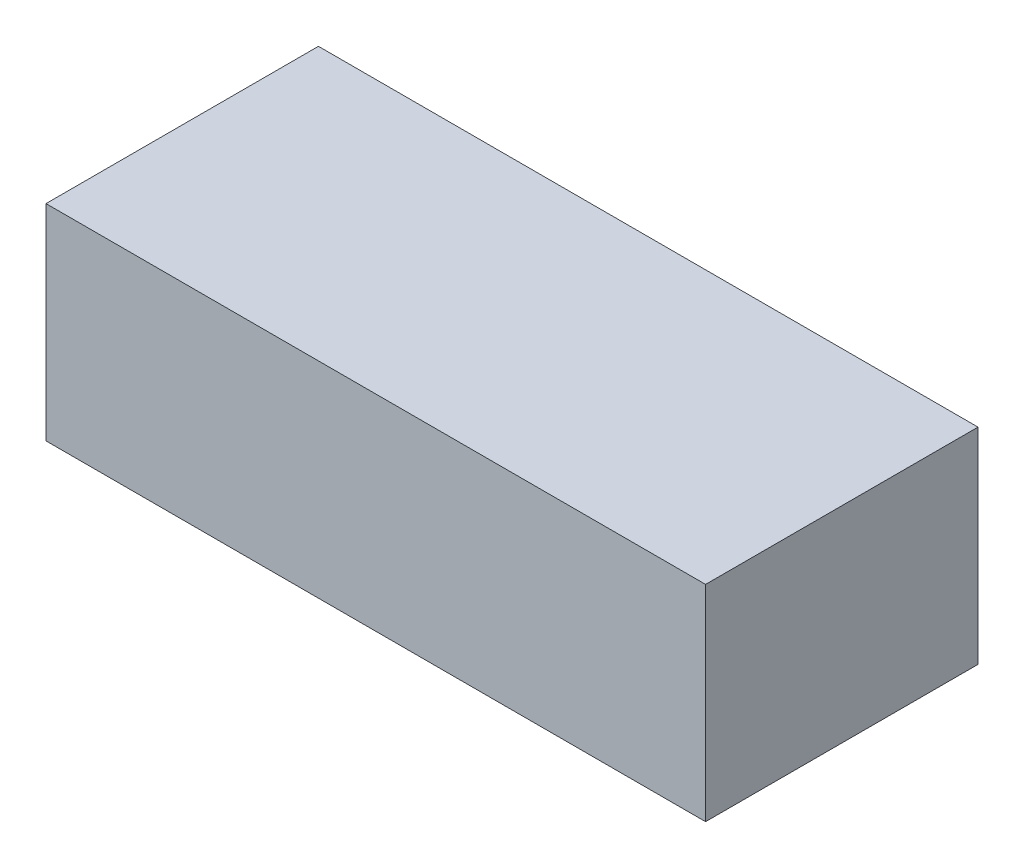
ISO-10303-21;
HEADER;
FILE_DESCRIPTION(('STEP AP214'),'2;1');
FILE_NAME('part.step','',(''),(''),'','','');
FILE_SCHEMA(('AUTOMOTIVE_DESIGN { 1 0 10303 214 1 1 1 1 }'));
ENDSEC;
DATA;
#1=APPLICATION_CONTEXT('core data for automotive mechanical design processes');
#2=APPLICATION_PROTOCOL_DEFINITION('international standard','automotive_design',2000,#1);
#3=PRODUCT_CONTEXT('',#1,'mechanical');
#4=PRODUCT('Part','Part','',(#3));
#5=PRODUCT_RELATED_PRODUCT_CATEGORY('part','',(#4));
#6=PRODUCT_DEFINITION_FORMATION('','',#4);
#7=PRODUCT_DEFINITION_CONTEXT('part definition',#1,'design');
#8=PRODUCT_DEFINITION('design','',#6,#7);
#9=PRODUCT_DEFINITION_SHAPE('','',#8);
#10=(LENGTH_UNIT() NAMED_UNIT(*) SI_UNIT(.MILLI.,.METRE.));
#11=(NAMED_UNIT(*) PLANE_ANGLE_UNIT() SI_UNIT($,.RADIAN.));
#12=(NAMED_UNIT(*) SI_UNIT($,.STERADIAN.) SOLID_ANGLE_UNIT());
#13=UNCERTAINTY_MEASURE_WITH_UNIT(LENGTH_MEASURE(1.E-05),#10,'distance_accuracy_value','');
#14=(GEOMETRIC_REPRESENTATION_CONTEXT(3) GLOBAL_UNCERTAINTY_ASSIGNED_CONTEXT((#13)) GLOBAL_UNIT_ASSIGNED_CONTEXT((#10,
#11,#12)) REPRESENTATION_CONTEXT('',''));
#15=CARTESIAN_POINT('',(0.,0.,0.));
#16=DIRECTION('',(0.,0.,1.));
#17=DIRECTION('',(1.,0.,0.));
#18=AXIS2_PLACEMENT_3D('',#15,#16,#17);
#19=CARTESIAN_POINT('',(69.,21.5,57.));
#20=DIRECTION('',(-1.,0.,0.));
#21=DIRECTION('',(0.,0.,1.));
#22=AXIS2_PLACEMENT_3D('',#19,#20,#21);
#23=PLANE('',#22);
#24=DIRECTION('',(0.,1.,0.));
#25=VECTOR('',#24,1.);
#26=CARTESIAN_POINT('',(69.,21.5,0.));
#27=LINE('',#26,#25);
#28=CARTESIAN_POINT('',(69.,-21.5,0.));
#29=VERTEX_POINT('',#28);
#30=CARTESIAN_POINT('',(69.,21.5,0.));
#31=VERTEX_POINT('',#30);
#32=EDGE_CURVE('E98',#29,#31,#27,.T.);
#33=ORIENTED_EDGE('',*,*,#32,.T.);
#34=DIRECTION('',(0.,0.,-1.));
#35=VECTOR('',#34,1.);
#36=CARTESIAN_POINT('',(69.,21.5,57.));
#37=LINE('',#36,#35);
#38=CARTESIAN_POINT('',(69.,21.5,57.));
#39=VERTEX_POINT('',#38);
#40=EDGE_CURVE('E11',#39,#31,#37,.T.);
#41=ORIENTED_EDGE('',*,*,#40,.F.);
#42=DIRECTION('',(0.,1.,0.));
#43=VECTOR('',#42,1.);
#44=CARTESIAN_POINT('',(69.,21.5,57.));
#45=LINE('',#44,#43);
#46=CARTESIAN_POINT('',(69.,-21.5,57.));
#47=VERTEX_POINT('',#46);
#48=EDGE_CURVE('E86',#47,#39,#45,.T.);
#49=ORIENTED_EDGE('',*,*,#48,.F.);
#50=DIRECTION('',(0.,0.,-1.));
#51=VECTOR('',#50,1.);
#52=CARTESIAN_POINT('',(69.,-21.5,57.));
#53=LINE('',#52,#51);
#54=EDGE_CURVE('E94',#47,#29,#53,.T.);
#55=ORIENTED_EDGE('',*,*,#54,.T.);
#56=EDGE_LOOP('',(#33,#41,#49,#55));
#57=FACE_BOUND('',#56,.T.);
#58=ADVANCED_FACE('F35',(#57),#23,.F.);
#59=CARTESIAN_POINT('',(-69.,21.5,57.));
#60=DIRECTION('',(0.,-1.,0.));
#61=DIRECTION('',(0.,0.,-1.));
#62=AXIS2_PLACEMENT_3D('',#59,#60,#61);
#63=PLANE('',#62);
#64=DIRECTION('',(-1.,0.,0.));
#65=VECTOR('',#64,1.);
#66=CARTESIAN_POINT('',(-69.,21.5,0.));
#67=LINE('',#66,#65);
#68=CARTESIAN_POINT('',(-69.,21.5,0.));
#69=VERTEX_POINT('',#68);
#70=EDGE_CURVE('E90',#31,#69,#67,.T.);
#71=ORIENTED_EDGE('',*,*,#70,.T.);
#72=DIRECTION('',(0.,0.,-1.));
#73=VECTOR('',#72,1.);
#74=CARTESIAN_POINT('',(-69.,21.5,57.));
#75=LINE('',#74,#73);
#76=CARTESIAN_POINT('',(-69.,21.5,57.));
#77=VERTEX_POINT('',#76);
#78=EDGE_CURVE('E43',#77,#69,#75,.T.);
#79=ORIENTED_EDGE('',*,*,#78,.F.);
#80=DIRECTION('',(-1.,0.,0.));
#81=VECTOR('',#80,1.);
#82=CARTESIAN_POINT('',(-69.,21.5,57.));
#83=LINE('',#82,#81);
#84=EDGE_CURVE('E81',#39,#77,#83,.T.);
#85=ORIENTED_EDGE('',*,*,#84,.F.);
#86=ORIENTED_EDGE('',*,*,#40,.T.);
#87=EDGE_LOOP('',(#71,#79,#85,#86));
#88=FACE_BOUND('',#87,.T.);
#89=ADVANCED_FACE('F89',(#88),#63,.F.);
#90=CARTESIAN_POINT('',(-69.,21.5,57.));
#91=DIRECTION('',(1.,0.,0.));
#92=DIRECTION('',(0.,0.,-1.));
#93=AXIS2_PLACEMENT_3D('',#90,#91,#92);
#94=PLANE('',#93);
#95=DIRECTION('',(0.,-1.,0.));
#96=VECTOR('',#95,1.);
#97=CARTESIAN_POINT('',(-69.,21.5,0.));
#98=LINE('',#97,#96);
#99=CARTESIAN_POINT('',(-69.,-21.5,0.));
#100=VERTEX_POINT('',#99);
#101=EDGE_CURVE('E68',#69,#100,#98,.T.);
#102=ORIENTED_EDGE('',*,*,#101,.T.);
#103=DIRECTION('',(0.,0.,-1.));
#104=VECTOR('',#103,1.);
#105=CARTESIAN_POINT('',(-69.,-21.5,57.));
#106=LINE('',#105,#104);
#107=CARTESIAN_POINT('',(-69.,-21.5,57.));
#108=VERTEX_POINT('',#107);
#109=EDGE_CURVE('E91',#108,#100,#106,.T.);
#110=ORIENTED_EDGE('',*,*,#109,.F.);
#111=DIRECTION('',(0.,-1.,0.));
#112=VECTOR('',#111,1.);
#113=CARTESIAN_POINT('',(-69.,21.5,57.));
#114=LINE('',#113,#112);
#115=EDGE_CURVE('E84',#77,#108,#114,.T.);
#116=ORIENTED_EDGE('',*,*,#115,.F.);
#117=ORIENTED_EDGE('',*,*,#78,.T.);
#118=EDGE_LOOP('',(#102,#110,#116,#117));
#119=FACE_BOUND('',#118,.T.);
#120=ADVANCED_FACE('F92',(#119),#94,.F.);
#121=CARTESIAN_POINT('',(-69.,-21.5,57.));
#122=DIRECTION('',(0.,1.,0.));
#123=DIRECTION('',(0.,0.,1.));
#124=AXIS2_PLACEMENT_3D('',#121,#122,#123);
#125=PLANE('',#124);
#126=DIRECTION('',(1.,0.,0.));
#127=VECTOR('',#126,1.);
#128=CARTESIAN_POINT('',(-69.,-21.5,0.));
#129=LINE('',#128,#127);
#130=EDGE_CURVE('E74',#100,#29,#129,.T.);
#131=ORIENTED_EDGE('',*,*,#130,.T.);
#132=ORIENTED_EDGE('',*,*,#54,.F.);
#133=DIRECTION('',(1.,0.,0.));
#134=VECTOR('',#133,1.);
#135=CARTESIAN_POINT('',(-69.,-21.5,57.));
#136=LINE('',#135,#134);
#137=EDGE_CURVE('E51',#108,#47,#136,.T.);
#138=ORIENTED_EDGE('',*,*,#137,.F.);
#139=ORIENTED_EDGE('',*,*,#109,.T.);
#140=EDGE_LOOP('',(#131,#132,#138,#139));
#141=FACE_BOUND('',#140,.T.);
#142=ADVANCED_FACE('F105',(#141),#125,.F.);
#143=CARTESIAN_POINT('',(0.,0.,57.));
#144=DIRECTION('',(0.,0.,1.));
#145=DIRECTION('',(1.,0.,0.));
#146=AXIS2_PLACEMENT_3D('',#143,#144,#145);
#147=PLANE('',#146);
#148=ORIENTED_EDGE('',*,*,#48,.T.);
#149=ORIENTED_EDGE('',*,*,#84,.T.);
#150=ORIENTED_EDGE('',*,*,#115,.T.);
#151=ORIENTED_EDGE('',*,*,#137,.T.);
#152=EDGE_LOOP('',(#148,#149,#150,#151));
#153=FACE_BOUND('',#152,.T.);
#154=ADVANCED_FACE('F82',(#153),#147,.T.);
#155=CARTESIAN_POINT('',(0.,0.,0.));
#156=DIRECTION('',(0.,0.,1.));
#157=DIRECTION('',(1.,0.,0.));
#158=AXIS2_PLACEMENT_3D('',#155,#156,#157);
#159=PLANE('',#158);
#160=ORIENTED_EDGE('',*,*,#32,.F.);
#161=ORIENTED_EDGE('',*,*,#130,.F.);
#162=ORIENTED_EDGE('',*,*,#101,.F.);
#163=ORIENTED_EDGE('',*,*,#70,.F.);
#164=EDGE_LOOP('',(#160,#161,#162,#163));
#165=FACE_BOUND('',#164,.T.);
#166=ADVANCED_FACE('F108',(#165),#159,.F.);
#167=CLOSED_SHELL('',(#58,#89,#120,#142,#154,#166));
#168=MANIFOLD_SOLID_BREP('B2',#167);
#169=ADVANCED_BREP_SHAPE_REPRESENTATION('',(#18,#168),#14);
#170=SHAPE_DEFINITION_REPRESENTATION(#9,#169);
ENDSEC;
END-ISO-10303-21;
